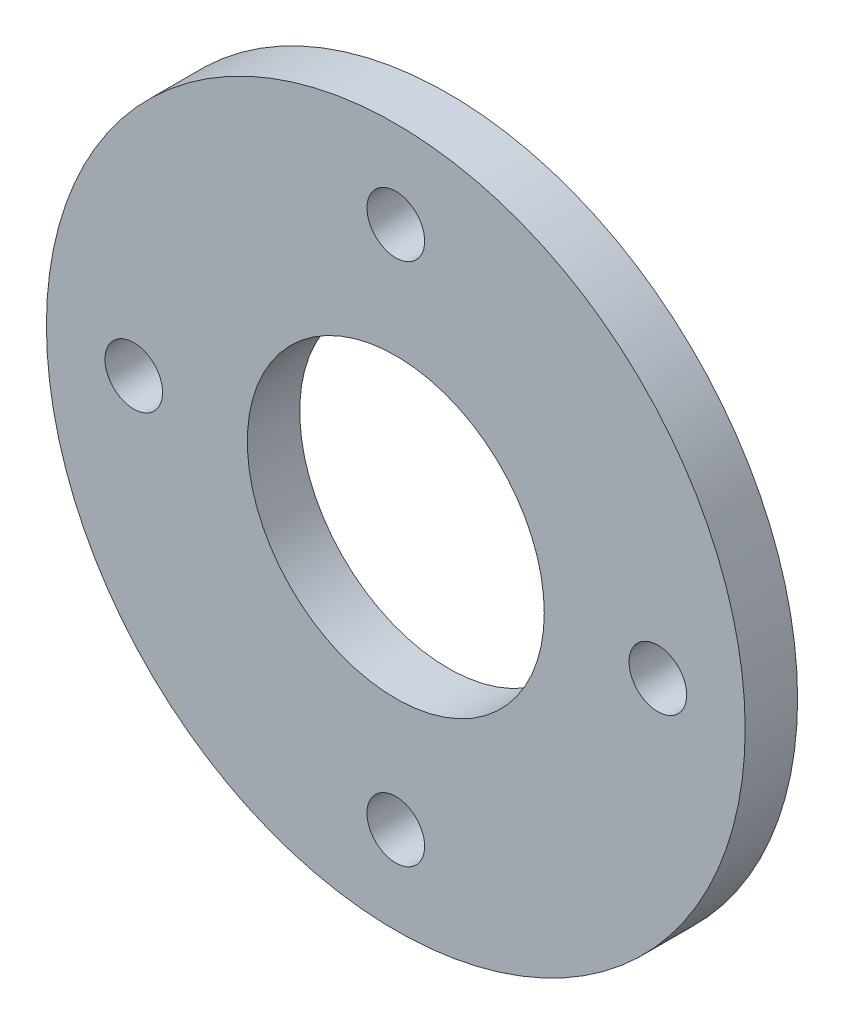
ISO-10303-21;
HEADER;
FILE_DESCRIPTION(('STEP AP214'),'2;1');
FILE_NAME('part.step','',(''),(''),'','','');
FILE_SCHEMA(('AUTOMOTIVE_DESIGN { 1 0 10303 214 1 1 1 1 }'));
ENDSEC;
DATA;
#1=APPLICATION_CONTEXT('core data for automotive mechanical design processes');
#2=APPLICATION_PROTOCOL_DEFINITION('international standard','automotive_design',2000,#1);
#3=PRODUCT_CONTEXT('',#1,'mechanical');
#4=PRODUCT('Part','Part','',(#3));
#5=PRODUCT_RELATED_PRODUCT_CATEGORY('part','',(#4));
#6=PRODUCT_DEFINITION_FORMATION('','',#4);
#7=PRODUCT_DEFINITION_CONTEXT('part definition',#1,'design');
#8=PRODUCT_DEFINITION('design','',#6,#7);
#9=PRODUCT_DEFINITION_SHAPE('','',#8);
#10=(LENGTH_UNIT() NAMED_UNIT(*) SI_UNIT(.MILLI.,.METRE.));
#11=(NAMED_UNIT(*) PLANE_ANGLE_UNIT() SI_UNIT($,.RADIAN.));
#12=(NAMED_UNIT(*) SI_UNIT($,.STERADIAN.) SOLID_ANGLE_UNIT());
#13=UNCERTAINTY_MEASURE_WITH_UNIT(LENGTH_MEASURE(1.E-05),#10,'distance_accuracy_value','');
#14=(GEOMETRIC_REPRESENTATION_CONTEXT(3) GLOBAL_UNCERTAINTY_ASSIGNED_CONTEXT((#13)) GLOBAL_UNIT_ASSIGNED_CONTEXT((#10,
#11,#12)) REPRESENTATION_CONTEXT('',''));
#15=CARTESIAN_POINT('',(0.,0.,0.));
#16=DIRECTION('',(0.,0.,1.));
#17=DIRECTION('',(1.,0.,0.));
#18=AXIS2_PLACEMENT_3D('',#15,#16,#17);
#19=CARTESIAN_POINT('',(0.,0.,3.));
#20=DIRECTION('',(0.,0.,-1.));
#21=DIRECTION('',(-1.,0.,0.));
#22=AXIS2_PLACEMENT_3D('',#19,#20,#21);
#23=CYLINDRICAL_SURFACE('',#22,20.);
#24=CARTESIAN_POINT('',(0.,0.,3.));
#25=DIRECTION('',(0.,0.,1.));
#26=DIRECTION('',(1.,0.,0.));
#27=AXIS2_PLACEMENT_3D('',#24,#25,#26);
#28=CIRCLE('',#27,20.);
#29=CARTESIAN_POINT('',(20.,0.,3.));
#30=VERTEX_POINT('',#29);
#31=EDGE_CURVE('E41',#30,#30,#28,.T.);
#32=ORIENTED_EDGE('',*,*,#31,.F.);
#33=EDGE_LOOP('',(#32));
#34=FACE_BOUND('',#33,.T.);
#35=CARTESIAN_POINT('',(0.,0.,0.));
#36=DIRECTION('',(0.,0.,1.));
#37=DIRECTION('',(1.,0.,0.));
#38=AXIS2_PLACEMENT_3D('',#35,#36,#37);
#39=CIRCLE('',#38,20.);
#40=CARTESIAN_POINT('',(20.,0.,0.));
#41=VERTEX_POINT('',#40);
#42=EDGE_CURVE('E61',#41,#41,#39,.T.);
#43=ORIENTED_EDGE('',*,*,#42,.T.);
#44=EDGE_LOOP('',(#43));
#45=FACE_BOUND('',#44,.T.);
#46=ADVANCED_FACE('F33',(#34,#45),#23,.T.);
#47=CARTESIAN_POINT('',(15.,0.,3.));
#48=DIRECTION('',(0.,0.,-1.));
#49=DIRECTION('',(-1.,0.,0.));
#50=AXIS2_PLACEMENT_3D('',#47,#48,#49);
#51=CYLINDRICAL_SURFACE('',#50,1.65);
#52=CARTESIAN_POINT('',(15.,0.,3.));
#53=DIRECTION('',(0.,0.,1.));
#54=DIRECTION('',(1.,0.,0.));
#55=AXIS2_PLACEMENT_3D('',#52,#53,#54);
#56=CIRCLE('',#55,1.65);
#57=CARTESIAN_POINT('',(16.65,0.,3.));
#58=VERTEX_POINT('',#57);
#59=EDGE_CURVE('E46',#58,#58,#56,.T.);
#60=ORIENTED_EDGE('',*,*,#59,.T.);
#61=EDGE_LOOP('',(#60));
#62=FACE_BOUND('',#61,.T.);
#63=CARTESIAN_POINT('',(15.,0.,0.));
#64=DIRECTION('',(0.,0.,1.));
#65=DIRECTION('',(1.,0.,0.));
#66=AXIS2_PLACEMENT_3D('',#63,#64,#65);
#67=CIRCLE('',#66,1.65);
#68=CARTESIAN_POINT('',(16.65,0.,0.));
#69=VERTEX_POINT('',#68);
#70=EDGE_CURVE('E59',#69,#69,#67,.T.);
#71=ORIENTED_EDGE('',*,*,#70,.F.);
#72=EDGE_LOOP('',(#71));
#73=FACE_BOUND('',#72,.T.);
#74=ADVANCED_FACE('F82',(#62,#73),#51,.F.);
#75=CARTESIAN_POINT('',(0.,15.,3.));
#76=DIRECTION('',(0.,0.,-1.));
#77=DIRECTION('',(-1.,0.,0.));
#78=AXIS2_PLACEMENT_3D('',#75,#76,#77);
#79=CYLINDRICAL_SURFACE('',#78,1.65);
#80=CARTESIAN_POINT('',(0.,15.,3.));
#81=DIRECTION('',(0.,0.,1.));
#82=DIRECTION('',(1.,0.,0.));
#83=AXIS2_PLACEMENT_3D('',#80,#81,#82);
#84=CIRCLE('',#83,1.65);
#85=CARTESIAN_POINT('',(1.65,15.,3.));
#86=VERTEX_POINT('',#85);
#87=EDGE_CURVE('E75',#86,#86,#84,.T.);
#88=ORIENTED_EDGE('',*,*,#87,.T.);
#89=EDGE_LOOP('',(#88));
#90=FACE_BOUND('',#89,.T.);
#91=CARTESIAN_POINT('',(0.,15.,0.));
#92=DIRECTION('',(0.,0.,1.));
#93=DIRECTION('',(1.,0.,0.));
#94=AXIS2_PLACEMENT_3D('',#91,#92,#93);
#95=CIRCLE('',#94,1.65);
#96=CARTESIAN_POINT('',(1.65,15.,0.));
#97=VERTEX_POINT('',#96);
#98=EDGE_CURVE('E56',#97,#97,#95,.T.);
#99=ORIENTED_EDGE('',*,*,#98,.F.);
#100=EDGE_LOOP('',(#99));
#101=FACE_BOUND('',#100,.T.);
#102=ADVANCED_FACE('F100',(#90,#101),#79,.F.);
#103=CARTESIAN_POINT('',(-15.,0.,3.));
#104=DIRECTION('',(0.,0.,-1.));
#105=DIRECTION('',(-1.,0.,0.));
#106=AXIS2_PLACEMENT_3D('',#103,#104,#105);
#107=CYLINDRICAL_SURFACE('',#106,1.65);
#108=CARTESIAN_POINT('',(-15.,0.,3.));
#109=DIRECTION('',(0.,0.,1.));
#110=DIRECTION('',(1.,0.,0.));
#111=AXIS2_PLACEMENT_3D('',#108,#109,#110);
#112=CIRCLE('',#111,1.65);
#113=CARTESIAN_POINT('',(-13.35,0.,3.));
#114=VERTEX_POINT('',#113);
#115=EDGE_CURVE('E70',#114,#114,#112,.T.);
#116=ORIENTED_EDGE('',*,*,#115,.T.);
#117=EDGE_LOOP('',(#116));
#118=FACE_BOUND('',#117,.T.);
#119=CARTESIAN_POINT('',(-15.,0.,0.));
#120=DIRECTION('',(0.,0.,1.));
#121=DIRECTION('',(1.,0.,0.));
#122=AXIS2_PLACEMENT_3D('',#119,#120,#121);
#123=CIRCLE('',#122,1.65);
#124=CARTESIAN_POINT('',(-13.35,0.,0.));
#125=VERTEX_POINT('',#124);
#126=EDGE_CURVE('E53',#125,#125,#123,.T.);
#127=ORIENTED_EDGE('',*,*,#126,.F.);
#128=EDGE_LOOP('',(#127));
#129=FACE_BOUND('',#128,.T.);
#130=ADVANCED_FACE('F106',(#118,#129),#107,.F.);
#131=CARTESIAN_POINT('',(0.,-15.,3.));
#132=DIRECTION('',(0.,0.,-1.));
#133=DIRECTION('',(-1.,0.,0.));
#134=AXIS2_PLACEMENT_3D('',#131,#132,#133);
#135=CYLINDRICAL_SURFACE('',#134,1.65);
#136=CARTESIAN_POINT('',(0.,-15.,3.));
#137=DIRECTION('',(0.,0.,1.));
#138=DIRECTION('',(1.,0.,0.));
#139=AXIS2_PLACEMENT_3D('',#136,#137,#138);
#140=CIRCLE('',#139,1.65);
#141=CARTESIAN_POINT('',(1.65,-15.,3.));
#142=VERTEX_POINT('',#141);
#143=EDGE_CURVE('E66',#142,#142,#140,.T.);
#144=ORIENTED_EDGE('',*,*,#143,.T.);
#145=EDGE_LOOP('',(#144));
#146=FACE_BOUND('',#145,.T.);
#147=CARTESIAN_POINT('',(0.,-15.,0.));
#148=DIRECTION('',(0.,0.,1.));
#149=DIRECTION('',(1.,0.,0.));
#150=AXIS2_PLACEMENT_3D('',#147,#148,#149);
#151=CIRCLE('',#150,1.65);
#152=CARTESIAN_POINT('',(1.65,-15.,0.));
#153=VERTEX_POINT('',#152);
#154=EDGE_CURVE('E50',#153,#153,#151,.T.);
#155=ORIENTED_EDGE('',*,*,#154,.F.);
#156=EDGE_LOOP('',(#155));
#157=FACE_BOUND('',#156,.T.);
#158=ADVANCED_FACE('F35',(#146,#157),#135,.F.);
#159=CARTESIAN_POINT('',(0.,0.,3.));
#160=DIRECTION('',(0.,0.,-1.));
#161=DIRECTION('',(-1.,0.,0.));
#162=AXIS2_PLACEMENT_3D('',#159,#160,#161);
#163=CYLINDRICAL_SURFACE('',#162,8.5);
#164=CARTESIAN_POINT('',(0.,0.,3.));
#165=DIRECTION('',(0.,0.,1.));
#166=DIRECTION('',(1.,0.,0.));
#167=AXIS2_PLACEMENT_3D('',#164,#165,#166);
#168=CIRCLE('',#167,8.5);
#169=CARTESIAN_POINT('',(8.5,0.,3.));
#170=VERTEX_POINT('',#169);
#171=EDGE_CURVE('E10',#170,#170,#168,.T.);
#172=ORIENTED_EDGE('',*,*,#171,.T.);
#173=EDGE_LOOP('',(#172));
#174=FACE_BOUND('',#173,.T.);
#175=CARTESIAN_POINT('',(0.,0.,0.));
#176=DIRECTION('',(0.,0.,1.));
#177=DIRECTION('',(1.,0.,0.));
#178=AXIS2_PLACEMENT_3D('',#175,#176,#177);
#179=CIRCLE('',#178,8.5);
#180=CARTESIAN_POINT('',(8.5,0.,0.));
#181=VERTEX_POINT('',#180);
#182=EDGE_CURVE('E37',#181,#181,#179,.T.);
#183=ORIENTED_EDGE('',*,*,#182,.F.);
#184=EDGE_LOOP('',(#183));
#185=FACE_BOUND('',#184,.T.);
#186=ADVANCED_FACE('F89',(#174,#185),#163,.F.);
#187=CARTESIAN_POINT('',(0.,0.,3.));
#188=DIRECTION('',(0.,0.,1.));
#189=DIRECTION('',(1.,0.,0.));
#190=AXIS2_PLACEMENT_3D('',#187,#188,#189);
#191=PLANE('',#190);
#192=ORIENTED_EDGE('',*,*,#143,.F.);
#193=EDGE_LOOP('',(#192));
#194=FACE_BOUND('',#193,.T.);
#195=ORIENTED_EDGE('',*,*,#115,.F.);
#196=EDGE_LOOP('',(#195));
#197=FACE_BOUND('',#196,.T.);
#198=ORIENTED_EDGE('',*,*,#87,.F.);
#199=EDGE_LOOP('',(#198));
#200=FACE_BOUND('',#199,.T.);
#201=ORIENTED_EDGE('',*,*,#59,.F.);
#202=EDGE_LOOP('',(#201));
#203=FACE_BOUND('',#202,.T.);
#204=ORIENTED_EDGE('',*,*,#31,.T.);
#205=EDGE_LOOP('',(#204));
#206=FACE_BOUND('',#205,.T.);
#207=ORIENTED_EDGE('',*,*,#171,.F.);
#208=EDGE_LOOP('',(#207));
#209=FACE_BOUND('',#208,.T.);
#210=ADVANCED_FACE('F85',(#194,#197,#200,#203,#206,#209),#191,.T.);
#211=CARTESIAN_POINT('',(0.,0.,0.));
#212=DIRECTION('',(0.,0.,1.));
#213=DIRECTION('',(1.,0.,0.));
#214=AXIS2_PLACEMENT_3D('',#211,#212,#213);
#215=PLANE('',#214);
#216=ORIENTED_EDGE('',*,*,#154,.T.);
#217=EDGE_LOOP('',(#216));
#218=FACE_BOUND('',#217,.T.);
#219=ORIENTED_EDGE('',*,*,#126,.T.);
#220=EDGE_LOOP('',(#219));
#221=FACE_BOUND('',#220,.T.);
#222=ORIENTED_EDGE('',*,*,#98,.T.);
#223=EDGE_LOOP('',(#222));
#224=FACE_BOUND('',#223,.T.);
#225=ORIENTED_EDGE('',*,*,#70,.T.);
#226=EDGE_LOOP('',(#225));
#227=FACE_BOUND('',#226,.T.);
#228=ORIENTED_EDGE('',*,*,#42,.F.);
#229=EDGE_LOOP('',(#228));
#230=FACE_BOUND('',#229,.T.);
#231=ORIENTED_EDGE('',*,*,#182,.T.);
#232=EDGE_LOOP('',(#231));
#233=FACE_BOUND('',#232,.T.);
#234=ADVANCED_FACE('F88',(#218,#221,#224,#227,#230,#233),#215,.F.);
#235=CLOSED_SHELL('',(#46,#74,#102,#130,#158,#186,#210,#234));
#236=MANIFOLD_SOLID_BREP('B2',#235);
#237=ADVANCED_BREP_SHAPE_REPRESENTATION('',(#18,#236),#14);
#238=SHAPE_DEFINITION_REPRESENTATION(#9,#237);
ENDSEC;
END-ISO-10303-21;
